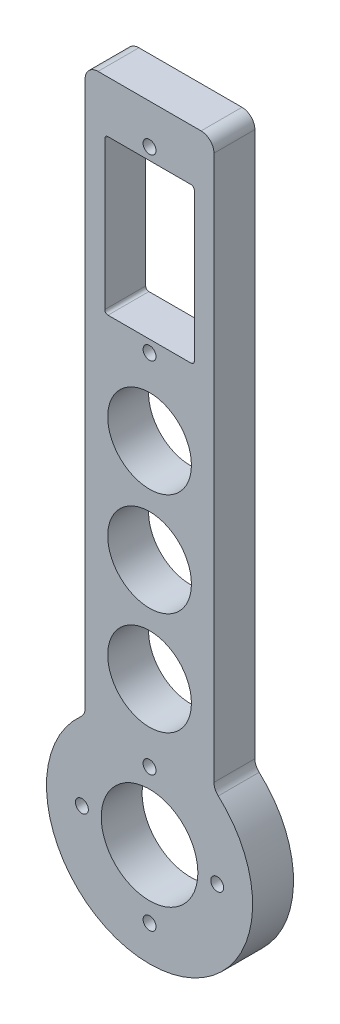
ISO-10303-21;
HEADER;
FILE_DESCRIPTION(('STEP AP214'),'2;1');
FILE_NAME('part.step','',(''),(''),'','','');
FILE_SCHEMA(('AUTOMOTIVE_DESIGN { 1 0 10303 214 1 1 1 1 }'));
ENDSEC;
DATA;
#1=APPLICATION_CONTEXT('core data for automotive mechanical design processes');
#2=APPLICATION_PROTOCOL_DEFINITION('international standard','automotive_design',2000,#1);
#3=PRODUCT_CONTEXT('',#1,'mechanical');
#4=PRODUCT('Part','Part','',(#3));
#5=PRODUCT_RELATED_PRODUCT_CATEGORY('part','',(#4));
#6=PRODUCT_DEFINITION_FORMATION('','',#4);
#7=PRODUCT_DEFINITION_CONTEXT('part definition',#1,'design');
#8=PRODUCT_DEFINITION('design','',#6,#7);
#9=PRODUCT_DEFINITION_SHAPE('','',#8);
#10=(LENGTH_UNIT() NAMED_UNIT(*) SI_UNIT(.MILLI.,.METRE.));
#11=(NAMED_UNIT(*) PLANE_ANGLE_UNIT() SI_UNIT($,.RADIAN.));
#12=(NAMED_UNIT(*) SI_UNIT($,.STERADIAN.) SOLID_ANGLE_UNIT());
#13=UNCERTAINTY_MEASURE_WITH_UNIT(LENGTH_MEASURE(1.E-05),#10,'distance_accuracy_value','');
#14=(GEOMETRIC_REPRESENTATION_CONTEXT(3) GLOBAL_UNCERTAINTY_ASSIGNED_CONTEXT((#13)) GLOBAL_UNIT_ASSIGNED_CONTEXT((#10,
#11,#12)) REPRESENTATION_CONTEXT('',''));
#15=CARTESIAN_POINT('',(0.,0.,0.));
#16=DIRECTION('',(0.,0.,1.));
#17=DIRECTION('',(1.,0.,0.));
#18=AXIS2_PLACEMENT_3D('',#15,#16,#17);
#19=CARTESIAN_POINT('',(0.,0.,6.35));
#20=DIRECTION('',(0.,0.,1.));
#21=DIRECTION('',(1.,0.,0.));
#22=AXIS2_PLACEMENT_3D('',#19,#20,#21);
#23=PLANE('',#22);
#24=CARTESIAN_POINT('',(0.,0.,6.35));
#25=DIRECTION('',(0.,0.,1.));
#26=DIRECTION('',(1.,0.,0.));
#27=AXIS2_PLACEMENT_3D('',#24,#25,#26);
#28=CIRCLE('',#27,7.5);
#29=CARTESIAN_POINT('',(7.5,0.,6.35));
#30=VERTEX_POINT('',#29);
#31=EDGE_CURVE('E683',#30,#30,#28,.T.);
#32=ORIENTED_EDGE('',*,*,#31,.F.);
#33=EDGE_LOOP('',(#32));
#34=FACE_BOUND('',#33,.T.);
#35=CARTESIAN_POINT('',(0.,54.325,6.35));
#36=DIRECTION('',(0.,0.,1.));
#37=DIRECTION('',(1.,0.,0.));
#38=AXIS2_PLACEMENT_3D('',#35,#36,#37);
#39=CIRCLE('',#38,6.5);
#40=CARTESIAN_POINT('',(6.5,54.325,6.35));
#41=VERTEX_POINT('',#40);
#42=EDGE_CURVE('E678',#41,#41,#39,.T.);
#43=ORIENTED_EDGE('',*,*,#42,.F.);
#44=EDGE_LOOP('',(#43));
#45=FACE_BOUND('',#44,.T.);
#46=CARTESIAN_POINT('',(0.,38.325,6.35));
#47=DIRECTION('',(0.,0.,1.));
#48=DIRECTION('',(1.,0.,0.));
#49=AXIS2_PLACEMENT_3D('',#46,#47,#48);
#50=CIRCLE('',#49,6.5);
#51=CARTESIAN_POINT('',(6.5,38.325,6.35));
#52=VERTEX_POINT('',#51);
#53=EDGE_CURVE('E675',#52,#52,#50,.T.);
#54=ORIENTED_EDGE('',*,*,#53,.F.);
#55=EDGE_LOOP('',(#54));
#56=FACE_BOUND('',#55,.T.);
#57=CARTESIAN_POINT('',(0.,22.325,6.35));
#58=DIRECTION('',(0.,0.,1.));
#59=DIRECTION('',(1.,0.,0.));
#60=AXIS2_PLACEMENT_3D('',#57,#58,#59);
#61=CIRCLE('',#60,6.5);
#62=CARTESIAN_POINT('',(6.5,22.325,6.35));
#63=VERTEX_POINT('',#62);
#64=EDGE_CURVE('E668',#63,#63,#61,.T.);
#65=ORIENTED_EDGE('',*,*,#64,.F.);
#66=EDGE_LOOP('',(#65));
#67=FACE_BOUND('',#66,.T.);
#68=DIRECTION('',(0.,1.,0.));
#69=VECTOR('',#68,1.);
#70=CARTESIAN_POINT('',(6.95,68.,6.35));
#71=LINE('',#70,#69);
#72=CARTESIAN_POINT('',(6.95,68.5,6.35));
#73=VERTEX_POINT('',#72);
#74=CARTESIAN_POINT('',(6.95,91.5,6.35));
#75=VERTEX_POINT('',#74);
#76=EDGE_CURVE('E236',#73,#75,#71,.T.);
#77=ORIENTED_EDGE('',*,*,#76,.F.);
#78=CARTESIAN_POINT('',(6.45,68.5,6.35));
#79=DIRECTION('',(0.,0.,1.));
#80=DIRECTION('',(1.,0.,0.));
#81=AXIS2_PLACEMENT_3D('',#78,#79,#80);
#82=CIRCLE('',#81,0.5);
#83=CARTESIAN_POINT('',(6.45,68.,6.35));
#84=VERTEX_POINT('',#83);
#85=EDGE_CURVE('E319',#73,#84,#82,.F.);
#86=ORIENTED_EDGE('',*,*,#85,.T.);
#87=DIRECTION('',(-1.,0.,0.));
#88=VECTOR('',#87,1.);
#89=CARTESIAN_POINT('',(6.95,68.,6.35));
#90=LINE('',#89,#88);
#91=CARTESIAN_POINT('',(-6.45,68.,6.35));
#92=VERTEX_POINT('',#91);
#93=EDGE_CURVE('E238',#84,#92,#90,.T.);
#94=ORIENTED_EDGE('',*,*,#93,.T.);
#95=CARTESIAN_POINT('',(-6.45,68.5,6.35));
#96=DIRECTION('',(0.,0.,1.));
#97=DIRECTION('',(1.,0.,0.));
#98=AXIS2_PLACEMENT_3D('',#95,#96,#97);
#99=CIRCLE('',#98,0.5);
#100=CARTESIAN_POINT('',(-6.95,68.5,6.35));
#101=VERTEX_POINT('',#100);
#102=EDGE_CURVE('E323',#92,#101,#99,.F.);
#103=ORIENTED_EDGE('',*,*,#102,.T.);
#104=DIRECTION('',(0.,1.,0.));
#105=VECTOR('',#104,1.);
#106=CARTESIAN_POINT('',(-6.95,68.,6.35));
#107=LINE('',#106,#105);
#108=CARTESIAN_POINT('',(-6.95,91.5,6.35));
#109=VERTEX_POINT('',#108);
#110=EDGE_CURVE('E235',#101,#109,#107,.T.);
#111=ORIENTED_EDGE('',*,*,#110,.T.);
#112=CARTESIAN_POINT('',(-6.45,91.5,6.35));
#113=DIRECTION('',(0.,0.,1.));
#114=DIRECTION('',(1.,0.,0.));
#115=AXIS2_PLACEMENT_3D('',#112,#113,#114);
#116=CIRCLE('',#115,0.5);
#117=CARTESIAN_POINT('',(-6.45,92.,6.35));
#118=VERTEX_POINT('',#117);
#119=EDGE_CURVE('E234',#109,#118,#116,.F.);
#120=ORIENTED_EDGE('',*,*,#119,.T.);
#121=DIRECTION('',(-1.,0.,0.));
#122=VECTOR('',#121,1.);
#123=CARTESIAN_POINT('',(6.95,92.,6.35));
#124=LINE('',#123,#122);
#125=CARTESIAN_POINT('',(6.45,92.,6.35));
#126=VERTEX_POINT('',#125);
#127=EDGE_CURVE('E225',#126,#118,#124,.T.);
#128=ORIENTED_EDGE('',*,*,#127,.F.);
#129=CARTESIAN_POINT('',(6.45,91.5,6.35));
#130=DIRECTION('',(0.,0.,1.));
#131=DIRECTION('',(1.,0.,0.));
#132=AXIS2_PLACEMENT_3D('',#129,#130,#131);
#133=CIRCLE('',#132,0.5);
#134=EDGE_CURVE('E208',#126,#75,#133,.F.);
#135=ORIENTED_EDGE('',*,*,#134,.T.);
#136=EDGE_LOOP('',(#77,#86,#94,#103,#111,#120,#128,#135));
#137=FACE_BOUND('',#136,.T.);
#138=CARTESIAN_POINT('',(10.5,0.,6.35));
#139=DIRECTION('',(0.,0.,1.));
#140=DIRECTION('',(1.,0.,0.));
#141=AXIS2_PLACEMENT_3D('',#138,#139,#140);
#142=CIRCLE('',#141,1.);
#143=CARTESIAN_POINT('',(11.5,0.,6.35));
#144=VERTEX_POINT('',#143);
#145=EDGE_CURVE('E257',#144,#144,#142,.T.);
#146=ORIENTED_EDGE('',*,*,#145,.F.);
#147=EDGE_LOOP('',(#146));
#148=FACE_BOUND('',#147,.T.);
#149=CARTESIAN_POINT('',(-10.5,0.,6.35));
#150=DIRECTION('',(0.,0.,1.));
#151=DIRECTION('',(1.,0.,0.));
#152=AXIS2_PLACEMENT_3D('',#149,#150,#151);
#153=CIRCLE('',#152,1.);
#154=CARTESIAN_POINT('',(-9.5,0.,6.35));
#155=VERTEX_POINT('',#154);
#156=EDGE_CURVE('E271',#155,#155,#153,.T.);
#157=ORIENTED_EDGE('',*,*,#156,.F.);
#158=EDGE_LOOP('',(#157));
#159=FACE_BOUND('',#158,.T.);
#160=DIRECTION('',(0.,-1.,0.));
#161=VECTOR('',#160,1.);
#162=CARTESIAN_POINT('',(10.,100.,6.35));
#163=LINE('',#162,#161);
#164=CARTESIAN_POINT('',(10.,98.,6.35));
#165=VERTEX_POINT('',#164);
#166=CARTESIAN_POINT('',(10.,13.4164078649988,6.35));
#167=VERTEX_POINT('',#166);
#168=EDGE_CURVE('E286',#165,#167,#163,.T.);
#169=ORIENTED_EDGE('',*,*,#168,.F.);
#170=CARTESIAN_POINT('',(8.,98.,6.35));
#171=DIRECTION('',(0.,0.,1.));
#172=DIRECTION('',(1.,0.,0.));
#173=AXIS2_PLACEMENT_3D('',#170,#171,#172);
#174=CIRCLE('',#173,2.);
#175=CARTESIAN_POINT('',(8.,100.,6.35));
#176=VERTEX_POINT('',#175);
#177=EDGE_CURVE('E345',#165,#176,#174,.T.);
#178=ORIENTED_EDGE('',*,*,#177,.T.);
#179=DIRECTION('',(1.,0.,0.));
#180=VECTOR('',#179,1.);
#181=CARTESIAN_POINT('',(-10.,100.,6.35));
#182=LINE('',#181,#180);
#183=CARTESIAN_POINT('',(-8.,100.,6.35));
#184=VERTEX_POINT('',#183);
#185=EDGE_CURVE('E290',#184,#176,#182,.T.);
#186=ORIENTED_EDGE('',*,*,#185,.F.);
#187=CARTESIAN_POINT('',(-8.,98.,6.35));
#188=DIRECTION('',(0.,0.,1.));
#189=DIRECTION('',(1.,0.,0.));
#190=AXIS2_PLACEMENT_3D('',#187,#188,#189);
#191=CIRCLE('',#190,2.);
#192=CARTESIAN_POINT('',(-10.,98.,6.35));
#193=VERTEX_POINT('',#192);
#194=EDGE_CURVE('E109',#184,#193,#191,.T.);
#195=ORIENTED_EDGE('',*,*,#194,.T.);
#196=DIRECTION('',(0.,1.,0.));
#197=VECTOR('',#196,1.);
#198=CARTESIAN_POINT('',(-10.,12.4899959967968,6.35));
#199=LINE('',#198,#197);
#200=CARTESIAN_POINT('',(-10.,13.4164078649987,6.35));
#201=VERTEX_POINT('',#200);
#202=EDGE_CURVE('E293',#201,#193,#199,.T.);
#203=ORIENTED_EDGE('',*,*,#202,.F.);
#204=CARTESIAN_POINT('',(-12.,13.4164078649987,6.35));
#205=DIRECTION('',(0.,0.,1.));
#206=DIRECTION('',(1.,0.,0.));
#207=AXIS2_PLACEMENT_3D('',#204,#205,#206);
#208=CIRCLE('',#207,2.);
#209=CARTESIAN_POINT('',(-10.6666666666667,11.9256958799989,6.35));
#210=VERTEX_POINT('',#209);
#211=EDGE_CURVE('E358',#201,#210,#208,.F.);
#212=ORIENTED_EDGE('',*,*,#211,.T.);
#213=CARTESIAN_POINT('',(0.,0.,6.35));
#214=DIRECTION('',(0.,0.,1.));
#215=DIRECTION('',(1.,0.,0.));
#216=AXIS2_PLACEMENT_3D('',#213,#214,#215);
#217=CIRCLE('',#216,16.);
#218=CARTESIAN_POINT('',(10.6666666666667,11.9256958799989,6.35));
#219=VERTEX_POINT('',#218);
#220=EDGE_CURVE('E283',#210,#219,#217,.T.);
#221=ORIENTED_EDGE('',*,*,#220,.T.);
#222=CARTESIAN_POINT('',(12.,13.4164078649987,6.35));
#223=DIRECTION('',(0.,0.,1.));
#224=DIRECTION('',(1.,0.,0.));
#225=AXIS2_PLACEMENT_3D('',#222,#223,#224);
#226=CIRCLE('',#225,2.);
#227=EDGE_CURVE('E13',#219,#167,#226,.F.);
#228=ORIENTED_EDGE('',*,*,#227,.T.);
#229=EDGE_LOOP('',(#169,#178,#186,#195,#203,#212,#221,#228));
#230=FACE_BOUND('',#229,.T.);
#231=CARTESIAN_POINT('',(0.,10.5,6.35));
#232=DIRECTION('',(0.,0.,1.));
#233=DIRECTION('',(1.,0.,0.));
#234=AXIS2_PLACEMENT_3D('',#231,#232,#233);
#235=CIRCLE('',#234,1.00000000000001);
#236=CARTESIAN_POINT('',(1.00000000000001,10.5,6.35));
#237=VERTEX_POINT('',#236);
#238=EDGE_CURVE('E277',#237,#237,#235,.T.);
#239=ORIENTED_EDGE('',*,*,#238,.F.);
#240=EDGE_LOOP('',(#239));
#241=FACE_BOUND('',#240,.T.);
#242=CARTESIAN_POINT('',(0.,-10.5,6.35));
#243=DIRECTION('',(0.,0.,1.));
#244=DIRECTION('',(1.,0.,0.));
#245=AXIS2_PLACEMENT_3D('',#242,#243,#244);
#246=CIRCLE('',#245,1.00000000000004);
#247=CARTESIAN_POINT('',(1.00000000000003,-10.5,6.35));
#248=VERTEX_POINT('',#247);
#249=EDGE_CURVE('E265',#248,#248,#246,.T.);
#250=ORIENTED_EDGE('',*,*,#249,.F.);
#251=EDGE_LOOP('',(#250));
#252=FACE_BOUND('',#251,.T.);
#253=CARTESIAN_POINT('',(0.,66.15,6.35));
#254=DIRECTION('',(0.,0.,1.));
#255=DIRECTION('',(1.,0.,0.));
#256=AXIS2_PLACEMENT_3D('',#253,#254,#255);
#257=CIRCLE('',#256,1.);
#258=CARTESIAN_POINT('',(1.,66.15,6.35));
#259=VERTEX_POINT('',#258);
#260=EDGE_CURVE('E641',#259,#259,#257,.T.);
#261=ORIENTED_EDGE('',*,*,#260,.F.);
#262=EDGE_LOOP('',(#261));
#263=FACE_BOUND('',#262,.T.);
#264=CARTESIAN_POINT('',(0.,93.85,6.35));
#265=DIRECTION('',(0.,0.,1.));
#266=DIRECTION('',(1.,0.,0.));
#267=AXIS2_PLACEMENT_3D('',#264,#265,#266);
#268=CIRCLE('',#267,1.);
#269=CARTESIAN_POINT('',(1.,93.85,6.35));
#270=VERTEX_POINT('',#269);
#271=EDGE_CURVE('E639',#270,#270,#268,.F.);
#272=ORIENTED_EDGE('',*,*,#271,.T.);
#273=EDGE_LOOP('',(#272));
#274=FACE_BOUND('',#273,.T.);
#275=ADVANCED_FACE('F94',(#34,#45,#56,#67,#137,#148,#159,#230,#241,#252,#263,#274),#23,.T.);
#276=CARTESIAN_POINT('',(0.,0.,0.));
#277=DIRECTION('',(0.,0.,1.));
#278=DIRECTION('',(1.,0.,0.));
#279=AXIS2_PLACEMENT_3D('',#276,#277,#278);
#280=PLANE('',#279);
#281=CARTESIAN_POINT('',(0.,0.,0.));
#282=DIRECTION('',(0.,0.,1.));
#283=DIRECTION('',(1.,0.,0.));
#284=AXIS2_PLACEMENT_3D('',#281,#282,#283);
#285=CIRCLE('',#284,7.5);
#286=CARTESIAN_POINT('',(7.5,0.,0.));
#287=VERTEX_POINT('',#286);
#288=EDGE_CURVE('E669',#287,#287,#285,.T.);
#289=ORIENTED_EDGE('',*,*,#288,.T.);
#290=EDGE_LOOP('',(#289));
#291=FACE_BOUND('',#290,.T.);
#292=CARTESIAN_POINT('',(0.,54.325,0.));
#293=DIRECTION('',(0.,0.,1.));
#294=DIRECTION('',(1.,0.,0.));
#295=AXIS2_PLACEMENT_3D('',#292,#293,#294);
#296=CIRCLE('',#295,6.5);
#297=CARTESIAN_POINT('',(6.5,54.325,0.));
#298=VERTEX_POINT('',#297);
#299=EDGE_CURVE('E250',#298,#298,#296,.T.);
#300=ORIENTED_EDGE('',*,*,#299,.T.);
#301=EDGE_LOOP('',(#300));
#302=FACE_BOUND('',#301,.T.);
#303=CARTESIAN_POINT('',(0.,38.325,0.));
#304=DIRECTION('',(0.,0.,1.));
#305=DIRECTION('',(1.,0.,0.));
#306=AXIS2_PLACEMENT_3D('',#303,#304,#305);
#307=CIRCLE('',#306,6.5);
#308=CARTESIAN_POINT('',(6.5,38.325,0.));
#309=VERTEX_POINT('',#308);
#310=EDGE_CURVE('E672',#309,#309,#307,.T.);
#311=ORIENTED_EDGE('',*,*,#310,.T.);
#312=EDGE_LOOP('',(#311));
#313=FACE_BOUND('',#312,.T.);
#314=CARTESIAN_POINT('',(0.,22.325,0.));
#315=DIRECTION('',(0.,0.,1.));
#316=DIRECTION('',(1.,0.,0.));
#317=AXIS2_PLACEMENT_3D('',#314,#315,#316);
#318=CIRCLE('',#317,6.5);
#319=CARTESIAN_POINT('',(6.5,22.325,0.));
#320=VERTEX_POINT('',#319);
#321=EDGE_CURVE('E665',#320,#320,#318,.T.);
#322=ORIENTED_EDGE('',*,*,#321,.T.);
#323=EDGE_LOOP('',(#322));
#324=FACE_BOUND('',#323,.T.);
#325=CARTESIAN_POINT('',(0.,66.15,0.));
#326=DIRECTION('',(0.,0.,1.));
#327=DIRECTION('',(1.,0.,0.));
#328=AXIS2_PLACEMENT_3D('',#325,#326,#327);
#329=CIRCLE('',#328,1.);
#330=CARTESIAN_POINT('',(1.,66.15,0.));
#331=VERTEX_POINT('',#330);
#332=EDGE_CURVE('E246',#331,#331,#329,.T.);
#333=ORIENTED_EDGE('',*,*,#332,.T.);
#334=EDGE_LOOP('',(#333));
#335=FACE_BOUND('',#334,.T.);
#336=CARTESIAN_POINT('',(10.5,0.,0.));
#337=DIRECTION('',(0.,0.,1.));
#338=DIRECTION('',(1.,0.,0.));
#339=AXIS2_PLACEMENT_3D('',#336,#337,#338);
#340=CIRCLE('',#339,1.);
#341=CARTESIAN_POINT('',(11.5,0.,0.));
#342=VERTEX_POINT('',#341);
#343=EDGE_CURVE('E261',#342,#342,#340,.T.);
#344=ORIENTED_EDGE('',*,*,#343,.T.);
#345=EDGE_LOOP('',(#344));
#346=FACE_BOUND('',#345,.T.);
#347=CARTESIAN_POINT('',(0.,-10.5,0.));
#348=DIRECTION('',(0.,0.,1.));
#349=DIRECTION('',(1.,0.,0.));
#350=AXIS2_PLACEMENT_3D('',#347,#348,#349);
#351=CIRCLE('',#350,1.00000000000004);
#352=CARTESIAN_POINT('',(1.00000000000003,-10.5,0.));
#353=VERTEX_POINT('',#352);
#354=EDGE_CURVE('E260',#353,#353,#351,.T.);
#355=ORIENTED_EDGE('',*,*,#354,.T.);
#356=EDGE_LOOP('',(#355));
#357=FACE_BOUND('',#356,.T.);
#358=CARTESIAN_POINT('',(-10.5,0.,0.));
#359=DIRECTION('',(0.,0.,1.));
#360=DIRECTION('',(1.,0.,0.));
#361=AXIS2_PLACEMENT_3D('',#358,#359,#360);
#362=CIRCLE('',#361,1.);
#363=CARTESIAN_POINT('',(-9.5,0.,0.));
#364=VERTEX_POINT('',#363);
#365=EDGE_CURVE('E268',#364,#364,#362,.T.);
#366=ORIENTED_EDGE('',*,*,#365,.T.);
#367=EDGE_LOOP('',(#366));
#368=FACE_BOUND('',#367,.T.);
#369=CARTESIAN_POINT('',(0.,10.5,0.));
#370=DIRECTION('',(0.,0.,1.));
#371=DIRECTION('',(1.,0.,0.));
#372=AXIS2_PLACEMENT_3D('',#369,#370,#371);
#373=CIRCLE('',#372,1.00000000000001);
#374=CARTESIAN_POINT('',(1.00000000000001,10.5,0.));
#375=VERTEX_POINT('',#374);
#376=EDGE_CURVE('E274',#375,#375,#373,.T.);
#377=ORIENTED_EDGE('',*,*,#376,.T.);
#378=EDGE_LOOP('',(#377));
#379=FACE_BOUND('',#378,.T.);
#380=DIRECTION('',(1.,0.,0.));
#381=VECTOR('',#380,1.);
#382=CARTESIAN_POINT('',(-10.,100.,0.));
#383=LINE('',#382,#381);
#384=CARTESIAN_POINT('',(-8.,100.,0.));
#385=VERTEX_POINT('',#384);
#386=CARTESIAN_POINT('',(8.,100.,0.));
#387=VERTEX_POINT('',#386);
#388=EDGE_CURVE('E300',#385,#387,#383,.T.);
#389=ORIENTED_EDGE('',*,*,#388,.T.);
#390=CARTESIAN_POINT('',(8.,98.,0.));
#391=DIRECTION('',(0.,0.,1.));
#392=DIRECTION('',(1.,0.,0.));
#393=AXIS2_PLACEMENT_3D('',#390,#391,#392);
#394=CIRCLE('',#393,2.);
#395=CARTESIAN_POINT('',(10.,98.,0.));
#396=VERTEX_POINT('',#395);
#397=EDGE_CURVE('E337',#387,#396,#394,.F.);
#398=ORIENTED_EDGE('',*,*,#397,.T.);
#399=DIRECTION('',(0.,-1.,0.));
#400=VECTOR('',#399,1.);
#401=CARTESIAN_POINT('',(10.,100.,0.));
#402=LINE('',#401,#400);
#403=CARTESIAN_POINT('',(10.,13.4164078649988,0.));
#404=VERTEX_POINT('',#403);
#405=EDGE_CURVE('E297',#396,#404,#402,.T.);
#406=ORIENTED_EDGE('',*,*,#405,.T.);
#407=CARTESIAN_POINT('',(12.,13.4164078649987,0.));
#408=DIRECTION('',(0.,0.,1.));
#409=DIRECTION('',(1.,0.,0.));
#410=AXIS2_PLACEMENT_3D('',#407,#408,#409);
#411=CIRCLE('',#410,2.);
#412=CARTESIAN_POINT('',(10.6666666666667,11.9256958799989,0.));
#413=VERTEX_POINT('',#412);
#414=EDGE_CURVE('E102',#404,#413,#411,.T.);
#415=ORIENTED_EDGE('',*,*,#414,.T.);
#416=CARTESIAN_POINT('',(0.,0.,0.));
#417=DIRECTION('',(0.,0.,1.));
#418=DIRECTION('',(1.,0.,0.));
#419=AXIS2_PLACEMENT_3D('',#416,#417,#418);
#420=CIRCLE('',#419,16.);
#421=CARTESIAN_POINT('',(-10.6666666666667,11.9256958799989,0.));
#422=VERTEX_POINT('',#421);
#423=EDGE_CURVE('E280',#422,#413,#420,.T.);
#424=ORIENTED_EDGE('',*,*,#423,.F.);
#425=CARTESIAN_POINT('',(-12.,13.4164078649987,0.));
#426=DIRECTION('',(0.,0.,1.));
#427=DIRECTION('',(1.,0.,0.));
#428=AXIS2_PLACEMENT_3D('',#425,#426,#427);
#429=CIRCLE('',#428,2.);
#430=CARTESIAN_POINT('',(-10.,13.4164078649987,0.));
#431=VERTEX_POINT('',#430);
#432=EDGE_CURVE('E356',#422,#431,#429,.T.);
#433=ORIENTED_EDGE('',*,*,#432,.T.);
#434=DIRECTION('',(0.,1.,0.));
#435=VECTOR('',#434,1.);
#436=CARTESIAN_POINT('',(-10.,12.4899959967968,0.));
#437=LINE('',#436,#435);
#438=CARTESIAN_POINT('',(-10.,98.,0.));
#439=VERTEX_POINT('',#438);
#440=EDGE_CURVE('E287',#431,#439,#437,.T.);
#441=ORIENTED_EDGE('',*,*,#440,.T.);
#442=CARTESIAN_POINT('',(-8.,98.,0.));
#443=DIRECTION('',(0.,0.,1.));
#444=DIRECTION('',(1.,0.,0.));
#445=AXIS2_PLACEMENT_3D('',#442,#443,#444);
#446=CIRCLE('',#445,2.);
#447=EDGE_CURVE('E335',#439,#385,#446,.F.);
#448=ORIENTED_EDGE('',*,*,#447,.T.);
#449=EDGE_LOOP('',(#389,#398,#406,#415,#424,#433,#441,#448));
#450=FACE_BOUND('',#449,.T.);
#451=DIRECTION('',(-1.,0.,0.));
#452=VECTOR('',#451,1.);
#453=CARTESIAN_POINT('',(6.95,68.,0.));
#454=LINE('',#453,#452);
#455=CARTESIAN_POINT('',(6.45,68.,0.));
#456=VERTEX_POINT('',#455);
#457=CARTESIAN_POINT('',(-6.45,68.,0.));
#458=VERTEX_POINT('',#457);
#459=EDGE_CURVE('E240',#456,#458,#454,.T.);
#460=ORIENTED_EDGE('',*,*,#459,.F.);
#461=CARTESIAN_POINT('',(6.45,68.5,0.));
#462=DIRECTION('',(0.,0.,1.));
#463=DIRECTION('',(1.,0.,0.));
#464=AXIS2_PLACEMENT_3D('',#461,#462,#463);
#465=CIRCLE('',#464,0.5);
#466=CARTESIAN_POINT('',(6.95,68.5,0.));
#467=VERTEX_POINT('',#466);
#468=EDGE_CURVE('E321',#456,#467,#465,.T.);
#469=ORIENTED_EDGE('',*,*,#468,.T.);
#470=DIRECTION('',(0.,1.,0.));
#471=VECTOR('',#470,1.);
#472=CARTESIAN_POINT('',(6.95,68.,0.));
#473=LINE('',#472,#471);
#474=CARTESIAN_POINT('',(6.95,91.5,0.));
#475=VERTEX_POINT('',#474);
#476=EDGE_CURVE('E247',#467,#475,#473,.T.);
#477=ORIENTED_EDGE('',*,*,#476,.T.);
#478=CARTESIAN_POINT('',(6.45,91.5,0.));
#479=DIRECTION('',(0.,0.,1.));
#480=DIRECTION('',(1.,0.,0.));
#481=AXIS2_PLACEMENT_3D('',#478,#479,#480);
#482=CIRCLE('',#481,0.5);
#483=CARTESIAN_POINT('',(6.45,92.,0.));
#484=VERTEX_POINT('',#483);
#485=EDGE_CURVE('E218',#475,#484,#482,.T.);
#486=ORIENTED_EDGE('',*,*,#485,.T.);
#487=DIRECTION('',(-1.,0.,0.));
#488=VECTOR('',#487,1.);
#489=CARTESIAN_POINT('',(6.95,92.,0.));
#490=LINE('',#489,#488);
#491=CARTESIAN_POINT('',(-6.45,92.,0.));
#492=VERTEX_POINT('',#491);
#493=EDGE_CURVE('E228',#484,#492,#490,.T.);
#494=ORIENTED_EDGE('',*,*,#493,.T.);
#495=CARTESIAN_POINT('',(-6.45,91.5,0.));
#496=DIRECTION('',(0.,0.,1.));
#497=DIRECTION('',(1.,0.,0.));
#498=AXIS2_PLACEMENT_3D('',#495,#496,#497);
#499=CIRCLE('',#498,0.5);
#500=CARTESIAN_POINT('',(-6.95,91.5,0.));
#501=VERTEX_POINT('',#500);
#502=EDGE_CURVE('E328',#492,#501,#499,.T.);
#503=ORIENTED_EDGE('',*,*,#502,.T.);
#504=DIRECTION('',(0.,1.,0.));
#505=VECTOR('',#504,1.);
#506=CARTESIAN_POINT('',(-6.95,68.,0.));
#507=LINE('',#506,#505);
#508=CARTESIAN_POINT('',(-6.95,68.5,0.));
#509=VERTEX_POINT('',#508);
#510=EDGE_CURVE('E252',#509,#501,#507,.T.);
#511=ORIENTED_EDGE('',*,*,#510,.F.);
#512=CARTESIAN_POINT('',(-6.45,68.5,0.));
#513=DIRECTION('',(0.,0.,1.));
#514=DIRECTION('',(1.,0.,0.));
#515=AXIS2_PLACEMENT_3D('',#512,#513,#514);
#516=CIRCLE('',#515,0.5);
#517=EDGE_CURVE('E325',#509,#458,#516,.T.);
#518=ORIENTED_EDGE('',*,*,#517,.T.);
#519=EDGE_LOOP('',(#460,#469,#477,#486,#494,#503,#511,#518));
#520=FACE_BOUND('',#519,.T.);
#521=CARTESIAN_POINT('',(0.,93.85,0.));
#522=DIRECTION('',(0.,0.,1.));
#523=DIRECTION('',(1.,0.,0.));
#524=AXIS2_PLACEMENT_3D('',#521,#522,#523);
#525=CIRCLE('',#524,1.);
#526=CARTESIAN_POINT('',(1.,93.85,0.));
#527=VERTEX_POINT('',#526);
#528=EDGE_CURVE('E264',#527,#527,#525,.F.);
#529=ORIENTED_EDGE('',*,*,#528,.F.);
#530=EDGE_LOOP('',(#529));
#531=FACE_BOUND('',#530,.T.);
#532=ADVANCED_FACE('F361',(#291,#302,#313,#324,#335,#346,#357,#368,#379,#450,#520,#531),#280,.F.);
#533=CARTESIAN_POINT('',(0.,0.,6.35));
#534=DIRECTION('',(0.,0.,-1.));
#535=DIRECTION('',(-1.,0.,0.));
#536=AXIS2_PLACEMENT_3D('',#533,#534,#535);
#537=CYLINDRICAL_SURFACE('',#536,16.);
#538=ORIENTED_EDGE('',*,*,#220,.F.);
#539=DIRECTION('',(0.,0.,-1.));
#540=VECTOR('',#539,1.);
#541=CARTESIAN_POINT('',(-10.6666666666667,11.9256958799989,6.35));
#542=LINE('',#541,#540);
#543=EDGE_CURVE('E353',#210,#422,#542,.T.);
#544=ORIENTED_EDGE('',*,*,#543,.T.);
#545=ORIENTED_EDGE('',*,*,#423,.T.);
#546=DIRECTION('',(0.,0.,-1.));
#547=VECTOR('',#546,1.);
#548=CARTESIAN_POINT('',(10.6666666666667,11.9256958799989,6.35));
#549=LINE('',#548,#547);
#550=EDGE_CURVE('E351',#413,#219,#549,.F.);
#551=ORIENTED_EDGE('',*,*,#550,.T.);
#552=EDGE_LOOP('',(#538,#544,#545,#551));
#553=FACE_BOUND('',#552,.T.);
#554=ADVANCED_FACE('F369',(#553),#537,.T.);
#555=CARTESIAN_POINT('',(10.,100.,6.35));
#556=DIRECTION('',(1.,0.,0.));
#557=DIRECTION('',(0.,1.,0.));
#558=AXIS2_PLACEMENT_3D('',#555,#556,#557);
#559=PLANE('',#558);
#560=ORIENTED_EDGE('',*,*,#405,.F.);
#561=DIRECTION('',(0.,0.,-1.));
#562=VECTOR('',#561,1.);
#563=CARTESIAN_POINT('',(10.,98.,6.35));
#564=LINE('',#563,#562);
#565=EDGE_CURVE('E342',#396,#165,#564,.F.);
#566=ORIENTED_EDGE('',*,*,#565,.T.);
#567=ORIENTED_EDGE('',*,*,#168,.T.);
#568=DIRECTION('',(0.,0.,-1.));
#569=VECTOR('',#568,1.);
#570=CARTESIAN_POINT('',(10.,13.4164078649987,6.35));
#571=LINE('',#570,#569);
#572=EDGE_CURVE('E339',#167,#404,#571,.T.);
#573=ORIENTED_EDGE('',*,*,#572,.T.);
#574=EDGE_LOOP('',(#560,#566,#567,#573));
#575=FACE_BOUND('',#574,.T.);
#576=ADVANCED_FACE('F376',(#575),#559,.T.);
#577=CARTESIAN_POINT('',(-10.,100.,6.35));
#578=DIRECTION('',(0.,1.,0.));
#579=DIRECTION('',(0.,0.,1.));
#580=AXIS2_PLACEMENT_3D('',#577,#578,#579);
#581=PLANE('',#580);
#582=ORIENTED_EDGE('',*,*,#185,.T.);
#583=DIRECTION('',(0.,0.,-1.));
#584=VECTOR('',#583,1.);
#585=CARTESIAN_POINT('',(8.,100.,6.35));
#586=LINE('',#585,#584);
#587=EDGE_CURVE('E332',#176,#387,#586,.T.);
#588=ORIENTED_EDGE('',*,*,#587,.T.);
#589=ORIENTED_EDGE('',*,*,#388,.F.);
#590=DIRECTION('',(0.,0.,-1.));
#591=VECTOR('',#590,1.);
#592=CARTESIAN_POINT('',(-8.,100.,6.35));
#593=LINE('',#592,#591);
#594=EDGE_CURVE('E330',#385,#184,#593,.F.);
#595=ORIENTED_EDGE('',*,*,#594,.T.);
#596=EDGE_LOOP('',(#582,#588,#589,#595));
#597=FACE_BOUND('',#596,.T.);
#598=ADVANCED_FACE('F382',(#597),#581,.T.);
#599=CARTESIAN_POINT('',(-10.,12.4899959967968,6.35));
#600=DIRECTION('',(-1.,0.,0.));
#601=DIRECTION('',(0.,-1.,0.));
#602=AXIS2_PLACEMENT_3D('',#599,#600,#601);
#603=PLANE('',#602);
#604=ORIENTED_EDGE('',*,*,#202,.T.);
#605=DIRECTION('',(0.,0.,-1.));
#606=VECTOR('',#605,1.);
#607=CARTESIAN_POINT('',(-10.,98.,6.35));
#608=LINE('',#607,#606);
#609=EDGE_CURVE('E348',#193,#439,#608,.T.);
#610=ORIENTED_EDGE('',*,*,#609,.T.);
#611=ORIENTED_EDGE('',*,*,#440,.F.);
#612=DIRECTION('',(0.,0.,-1.));
#613=VECTOR('',#612,1.);
#614=CARTESIAN_POINT('',(-10.,13.4164078649987,6.35));
#615=LINE('',#614,#613);
#616=EDGE_CURVE('E116',#431,#201,#615,.F.);
#617=ORIENTED_EDGE('',*,*,#616,.T.);
#618=EDGE_LOOP('',(#604,#610,#611,#617));
#619=FACE_BOUND('',#618,.T.);
#620=ADVANCED_FACE('F388',(#619),#603,.T.);
#621=CARTESIAN_POINT('',(0.,10.5,6.35));
#622=DIRECTION('',(0.,0.,-1.));
#623=DIRECTION('',(-1.,0.,0.));
#624=AXIS2_PLACEMENT_3D('',#621,#622,#623);
#625=CYLINDRICAL_SURFACE('',#624,1.00000000000001);
#626=ORIENTED_EDGE('',*,*,#238,.T.);
#627=EDGE_LOOP('',(#626));
#628=FACE_BOUND('',#627,.T.);
#629=ORIENTED_EDGE('',*,*,#376,.F.);
#630=EDGE_LOOP('',(#629));
#631=FACE_BOUND('',#630,.T.);
#632=ADVANCED_FACE('F411',(#628,#631),#625,.F.);
#633=CARTESIAN_POINT('',(-10.5,0.,6.35));
#634=DIRECTION('',(0.,0.,-1.));
#635=DIRECTION('',(-1.,0.,0.));
#636=AXIS2_PLACEMENT_3D('',#633,#634,#635);
#637=CYLINDRICAL_SURFACE('',#636,1.);
#638=ORIENTED_EDGE('',*,*,#156,.T.);
#639=EDGE_LOOP('',(#638));
#640=FACE_BOUND('',#639,.T.);
#641=ORIENTED_EDGE('',*,*,#365,.F.);
#642=EDGE_LOOP('',(#641));
#643=FACE_BOUND('',#642,.T.);
#644=ADVANCED_FACE('F527',(#640,#643),#637,.F.);
#645=CARTESIAN_POINT('',(0.,-10.5,6.35));
#646=DIRECTION('',(0.,0.,-1.));
#647=DIRECTION('',(-1.,0.,0.));
#648=AXIS2_PLACEMENT_3D('',#645,#646,#647);
#649=CYLINDRICAL_SURFACE('',#648,1.00000000000004);
#650=ORIENTED_EDGE('',*,*,#249,.T.);
#651=EDGE_LOOP('',(#650));
#652=FACE_BOUND('',#651,.T.);
#653=ORIENTED_EDGE('',*,*,#354,.F.);
#654=EDGE_LOOP('',(#653));
#655=FACE_BOUND('',#654,.T.);
#656=ADVANCED_FACE('F534',(#652,#655),#649,.F.);
#657=CARTESIAN_POINT('',(10.5,0.,6.35));
#658=DIRECTION('',(0.,0.,-1.));
#659=DIRECTION('',(-1.,0.,0.));
#660=AXIS2_PLACEMENT_3D('',#657,#658,#659);
#661=CYLINDRICAL_SURFACE('',#660,1.);
#662=ORIENTED_EDGE('',*,*,#145,.T.);
#663=EDGE_LOOP('',(#662));
#664=FACE_BOUND('',#663,.T.);
#665=ORIENTED_EDGE('',*,*,#343,.F.);
#666=EDGE_LOOP('',(#665));
#667=FACE_BOUND('',#666,.T.);
#668=ADVANCED_FACE('F541',(#664,#667),#661,.F.);
#669=CARTESIAN_POINT('',(6.95,68.,0.));
#670=DIRECTION('',(0.,1.,0.));
#671=DIRECTION('',(-1.,0.,0.));
#672=AXIS2_PLACEMENT_3D('',#669,#670,#671);
#673=PLANE('',#672);
#674=ORIENTED_EDGE('',*,*,#93,.F.);
#675=DIRECTION('',(0.,0.,1.));
#676=VECTOR('',#675,1.);
#677=CARTESIAN_POINT('',(6.45,68.,0.));
#678=LINE('',#677,#676);
#679=EDGE_CURVE('E312',#84,#456,#678,.F.);
#680=ORIENTED_EDGE('',*,*,#679,.T.);
#681=ORIENTED_EDGE('',*,*,#459,.T.);
#682=DIRECTION('',(0.,0.,1.));
#683=VECTOR('',#682,1.);
#684=CARTESIAN_POINT('',(-6.45,68.,6.35));
#685=LINE('',#684,#683);
#686=EDGE_CURVE('E309',#458,#92,#685,.T.);
#687=ORIENTED_EDGE('',*,*,#686,.T.);
#688=EDGE_LOOP('',(#674,#680,#681,#687));
#689=FACE_BOUND('',#688,.T.);
#690=ADVANCED_FACE('F549',(#689),#673,.T.);
#691=CARTESIAN_POINT('',(-6.95,68.,0.));
#692=DIRECTION('',(1.,0.,0.));
#693=DIRECTION('',(0.,0.,-1.));
#694=AXIS2_PLACEMENT_3D('',#691,#692,#693);
#695=PLANE('',#694);
#696=ORIENTED_EDGE('',*,*,#110,.F.);
#697=DIRECTION('',(0.,0.,1.));
#698=VECTOR('',#697,1.);
#699=CARTESIAN_POINT('',(-6.95,68.5,0.));
#700=LINE('',#699,#698);
#701=EDGE_CURVE('E219',#101,#509,#700,.F.);
#702=ORIENTED_EDGE('',*,*,#701,.T.);
#703=ORIENTED_EDGE('',*,*,#510,.T.);
#704=DIRECTION('',(0.,0.,1.));
#705=VECTOR('',#704,1.);
#706=CARTESIAN_POINT('',(-6.95,91.5,0.));
#707=LINE('',#706,#705);
#708=EDGE_CURVE('E314',#501,#109,#707,.T.);
#709=ORIENTED_EDGE('',*,*,#708,.T.);
#710=EDGE_LOOP('',(#696,#702,#703,#709));
#711=FACE_BOUND('',#710,.T.);
#712=ADVANCED_FACE('F557',(#711),#695,.T.);
#713=CARTESIAN_POINT('',(6.95,92.,0.));
#714=DIRECTION('',(0.,1.,0.));
#715=DIRECTION('',(0.,0.,1.));
#716=AXIS2_PLACEMENT_3D('',#713,#714,#715);
#717=PLANE('',#716);
#718=ORIENTED_EDGE('',*,*,#493,.F.);
#719=DIRECTION('',(0.,0.,1.));
#720=VECTOR('',#719,1.);
#721=CARTESIAN_POINT('',(6.45,92.,6.35));
#722=LINE('',#721,#720);
#723=EDGE_CURVE('E212',#484,#126,#722,.T.);
#724=ORIENTED_EDGE('',*,*,#723,.T.);
#725=ORIENTED_EDGE('',*,*,#127,.T.);
#726=DIRECTION('',(0.,0.,1.));
#727=VECTOR('',#726,1.);
#728=CARTESIAN_POINT('',(-6.45,92.,0.));
#729=LINE('',#728,#727);
#730=EDGE_CURVE('E230',#118,#492,#729,.F.);
#731=ORIENTED_EDGE('',*,*,#730,.T.);
#732=EDGE_LOOP('',(#718,#724,#725,#731));
#733=FACE_BOUND('',#732,.T.);
#734=ADVANCED_FACE('F224',(#733),#717,.F.);
#735=CARTESIAN_POINT('',(6.95,68.,0.));
#736=DIRECTION('',(1.,0.,0.));
#737=DIRECTION('',(0.,0.,-1.));
#738=AXIS2_PLACEMENT_3D('',#735,#736,#737);
#739=PLANE('',#738);
#740=ORIENTED_EDGE('',*,*,#76,.T.);
#741=DIRECTION('',(0.,0.,1.));
#742=VECTOR('',#741,1.);
#743=CARTESIAN_POINT('',(6.95,91.5,0.));
#744=LINE('',#743,#742);
#745=EDGE_CURVE('E213',#75,#475,#744,.F.);
#746=ORIENTED_EDGE('',*,*,#745,.T.);
#747=ORIENTED_EDGE('',*,*,#476,.F.);
#748=DIRECTION('',(0.,0.,1.));
#749=VECTOR('',#748,1.);
#750=CARTESIAN_POINT('',(6.95,68.5,0.));
#751=LINE('',#750,#749);
#752=EDGE_CURVE('E229',#467,#73,#751,.T.);
#753=ORIENTED_EDGE('',*,*,#752,.T.);
#754=EDGE_LOOP('',(#740,#746,#747,#753));
#755=FACE_BOUND('',#754,.T.);
#756=ADVANCED_FACE('F573',(#755),#739,.F.);
#757=CARTESIAN_POINT('',(0.,66.15,0.));
#758=DIRECTION('',(0.,0.,1.));
#759=DIRECTION('',(1.,0.,0.));
#760=AXIS2_PLACEMENT_3D('',#757,#758,#759);
#761=CYLINDRICAL_SURFACE('',#760,1.);
#762=ORIENTED_EDGE('',*,*,#332,.F.);
#763=EDGE_LOOP('',(#762));
#764=FACE_BOUND('',#763,.T.);
#765=ORIENTED_EDGE('',*,*,#260,.T.);
#766=EDGE_LOOP('',(#765));
#767=FACE_BOUND('',#766,.T.);
#768=ADVANCED_FACE('F580',(#764,#767),#761,.F.);
#769=CARTESIAN_POINT('',(0.,93.85,0.));
#770=DIRECTION('',(0.,0.,1.));
#771=DIRECTION('',(1.,0.,0.));
#772=AXIS2_PLACEMENT_3D('',#769,#770,#771);
#773=CYLINDRICAL_SURFACE('',#772,1.);
#774=ORIENTED_EDGE('',*,*,#528,.T.);
#775=EDGE_LOOP('',(#774));
#776=FACE_BOUND('',#775,.T.);
#777=ORIENTED_EDGE('',*,*,#271,.F.);
#778=EDGE_LOOP('',(#777));
#779=FACE_BOUND('',#778,.T.);
#780=ADVANCED_FACE('F425',(#776,#779),#773,.F.);
#781=CARTESIAN_POINT('',(6.45,91.5,0.));
#782=DIRECTION('',(0.,0.,-1.));
#783=DIRECTION('',(-1.,0.,0.));
#784=AXIS2_PLACEMENT_3D('',#781,#782,#783);
#785=CYLINDRICAL_SURFACE('',#784,0.5);
#786=ORIENTED_EDGE('',*,*,#485,.F.);
#787=ORIENTED_EDGE('',*,*,#745,.F.);
#788=ORIENTED_EDGE('',*,*,#134,.F.);
#789=ORIENTED_EDGE('',*,*,#723,.F.);
#790=EDGE_LOOP('',(#786,#787,#788,#789));
#791=FACE_BOUND('',#790,.T.);
#792=ADVANCED_FACE('F211',(#791),#785,.F.);
#793=CARTESIAN_POINT('',(6.45,68.5,0.));
#794=DIRECTION('',(0.,0.,1.));
#795=DIRECTION('',(1.,0.,0.));
#796=AXIS2_PLACEMENT_3D('',#793,#794,#795);
#797=CYLINDRICAL_SURFACE('',#796,0.5);
#798=ORIENTED_EDGE('',*,*,#468,.F.);
#799=ORIENTED_EDGE('',*,*,#679,.F.);
#800=ORIENTED_EDGE('',*,*,#85,.F.);
#801=ORIENTED_EDGE('',*,*,#752,.F.);
#802=EDGE_LOOP('',(#798,#799,#800,#801));
#803=FACE_BOUND('',#802,.T.);
#804=ADVANCED_FACE('F424',(#803),#797,.F.);
#805=CARTESIAN_POINT('',(-6.45,68.5,0.));
#806=DIRECTION('',(0.,0.,-1.));
#807=DIRECTION('',(-1.,0.,0.));
#808=AXIS2_PLACEMENT_3D('',#805,#806,#807);
#809=CYLINDRICAL_SURFACE('',#808,0.5);
#810=ORIENTED_EDGE('',*,*,#517,.F.);
#811=ORIENTED_EDGE('',*,*,#701,.F.);
#812=ORIENTED_EDGE('',*,*,#102,.F.);
#813=ORIENTED_EDGE('',*,*,#686,.F.);
#814=EDGE_LOOP('',(#810,#811,#812,#813));
#815=FACE_BOUND('',#814,.T.);
#816=ADVANCED_FACE('F428',(#815),#809,.F.);
#817=CARTESIAN_POINT('',(-6.45,91.5,0.));
#818=DIRECTION('',(0.,0.,1.));
#819=DIRECTION('',(1.,0.,0.));
#820=AXIS2_PLACEMENT_3D('',#817,#818,#819);
#821=CYLINDRICAL_SURFACE('',#820,0.5);
#822=ORIENTED_EDGE('',*,*,#502,.F.);
#823=ORIENTED_EDGE('',*,*,#730,.F.);
#824=ORIENTED_EDGE('',*,*,#119,.F.);
#825=ORIENTED_EDGE('',*,*,#708,.F.);
#826=EDGE_LOOP('',(#822,#823,#824,#825));
#827=FACE_BOUND('',#826,.T.);
#828=ADVANCED_FACE('F432',(#827),#821,.F.);
#829=CARTESIAN_POINT('',(8.,98.,6.35));
#830=DIRECTION('',(0.,0.,-1.));
#831=DIRECTION('',(-1.,0.,0.));
#832=AXIS2_PLACEMENT_3D('',#829,#830,#831);
#833=CYLINDRICAL_SURFACE('',#832,2.);
#834=ORIENTED_EDGE('',*,*,#177,.F.);
#835=ORIENTED_EDGE('',*,*,#565,.F.);
#836=ORIENTED_EDGE('',*,*,#397,.F.);
#837=ORIENTED_EDGE('',*,*,#587,.F.);
#838=EDGE_LOOP('',(#834,#835,#836,#837));
#839=FACE_BOUND('',#838,.T.);
#840=ADVANCED_FACE('F379',(#839),#833,.T.);
#841=CARTESIAN_POINT('',(-8.,98.,6.35));
#842=DIRECTION('',(0.,0.,-1.));
#843=DIRECTION('',(-1.,0.,0.));
#844=AXIS2_PLACEMENT_3D('',#841,#842,#843);
#845=CYLINDRICAL_SURFACE('',#844,2.);
#846=ORIENTED_EDGE('',*,*,#194,.F.);
#847=ORIENTED_EDGE('',*,*,#594,.F.);
#848=ORIENTED_EDGE('',*,*,#447,.F.);
#849=ORIENTED_EDGE('',*,*,#609,.F.);
#850=EDGE_LOOP('',(#846,#847,#848,#849));
#851=FACE_BOUND('',#850,.T.);
#852=ADVANCED_FACE('F386',(#851),#845,.T.);
#853=CARTESIAN_POINT('',(-12.,13.4164078649987,6.35));
#854=DIRECTION('',(0.,0.,-1.));
#855=DIRECTION('',(-1.,0.,0.));
#856=AXIS2_PLACEMENT_3D('',#853,#854,#855);
#857=CYLINDRICAL_SURFACE('',#856,2.);
#858=ORIENTED_EDGE('',*,*,#211,.F.);
#859=ORIENTED_EDGE('',*,*,#616,.F.);
#860=ORIENTED_EDGE('',*,*,#432,.F.);
#861=ORIENTED_EDGE('',*,*,#543,.F.);
#862=EDGE_LOOP('',(#858,#859,#860,#861));
#863=FACE_BOUND('',#862,.T.);
#864=ADVANCED_FACE('F391',(#863),#857,.F.);
#865=CARTESIAN_POINT('',(12.,13.4164078649987,6.35));
#866=DIRECTION('',(0.,0.,-1.));
#867=DIRECTION('',(-1.,0.,0.));
#868=AXIS2_PLACEMENT_3D('',#865,#866,#867);
#869=CYLINDRICAL_SURFACE('',#868,2.);
#870=ORIENTED_EDGE('',*,*,#227,.F.);
#871=ORIENTED_EDGE('',*,*,#550,.F.);
#872=ORIENTED_EDGE('',*,*,#414,.F.);
#873=ORIENTED_EDGE('',*,*,#572,.F.);
#874=EDGE_LOOP('',(#870,#871,#872,#873));
#875=FACE_BOUND('',#874,.T.);
#876=ADVANCED_FACE('F96',(#875),#869,.F.);
#877=CARTESIAN_POINT('',(0.,22.325,0.));
#878=DIRECTION('',(0.,0.,1.));
#879=DIRECTION('',(1.,0.,0.));
#880=AXIS2_PLACEMENT_3D('',#877,#878,#879);
#881=CYLINDRICAL_SURFACE('',#880,6.5);
#882=ORIENTED_EDGE('',*,*,#321,.F.);
#883=EDGE_LOOP('',(#882));
#884=FACE_BOUND('',#883,.T.);
#885=ORIENTED_EDGE('',*,*,#64,.T.);
#886=EDGE_LOOP('',(#885));
#887=FACE_BOUND('',#886,.T.);
#888=ADVANCED_FACE('F397',(#884,#887),#881,.F.);
#889=CARTESIAN_POINT('',(0.,38.325,0.));
#890=DIRECTION('',(0.,0.,1.));
#891=DIRECTION('',(1.,0.,0.));
#892=AXIS2_PLACEMENT_3D('',#889,#890,#891);
#893=CYLINDRICAL_SURFACE('',#892,6.5);
#894=ORIENTED_EDGE('',*,*,#310,.F.);
#895=EDGE_LOOP('',(#894));
#896=FACE_BOUND('',#895,.T.);
#897=ORIENTED_EDGE('',*,*,#53,.T.);
#898=EDGE_LOOP('',(#897));
#899=FACE_BOUND('',#898,.T.);
#900=ADVANCED_FACE('F466',(#896,#899),#893,.F.);
#901=CARTESIAN_POINT('',(0.,54.325,0.));
#902=DIRECTION('',(0.,0.,1.));
#903=DIRECTION('',(1.,0.,0.));
#904=AXIS2_PLACEMENT_3D('',#901,#902,#903);
#905=CYLINDRICAL_SURFACE('',#904,6.5);
#906=ORIENTED_EDGE('',*,*,#299,.F.);
#907=EDGE_LOOP('',(#906));
#908=FACE_BOUND('',#907,.T.);
#909=ORIENTED_EDGE('',*,*,#42,.T.);
#910=EDGE_LOOP('',(#909));
#911=FACE_BOUND('',#910,.T.);
#912=ADVANCED_FACE('F475',(#908,#911),#905,.F.);
#913=CARTESIAN_POINT('',(0.,0.,0.));
#914=DIRECTION('',(0.,0.,1.));
#915=DIRECTION('',(1.,0.,0.));
#916=AXIS2_PLACEMENT_3D('',#913,#914,#915);
#917=CYLINDRICAL_SURFACE('',#916,7.5);
#918=ORIENTED_EDGE('',*,*,#288,.F.);
#919=EDGE_LOOP('',(#918));
#920=FACE_BOUND('',#919,.T.);
#921=ORIENTED_EDGE('',*,*,#31,.T.);
#922=EDGE_LOOP('',(#921));
#923=FACE_BOUND('',#922,.T.);
#924=ADVANCED_FACE('F484',(#920,#923),#917,.F.);
#925=CLOSED_SHELL('',(#275,#532,#554,#576,#598,#620,#632,#644,#656,#668,#690,#712,#734,#756,
#768,#780,#792,#804,#816,#828,#840,#852,#864,#876,#888,#900,#912,#924));
#926=MANIFOLD_SOLID_BREP('B2',#925);
#927=ADVANCED_BREP_SHAPE_REPRESENTATION('',(#18,#926),#14);
#928=SHAPE_DEFINITION_REPRESENTATION(#9,#927);
ENDSEC;
END-ISO-10303-21;
